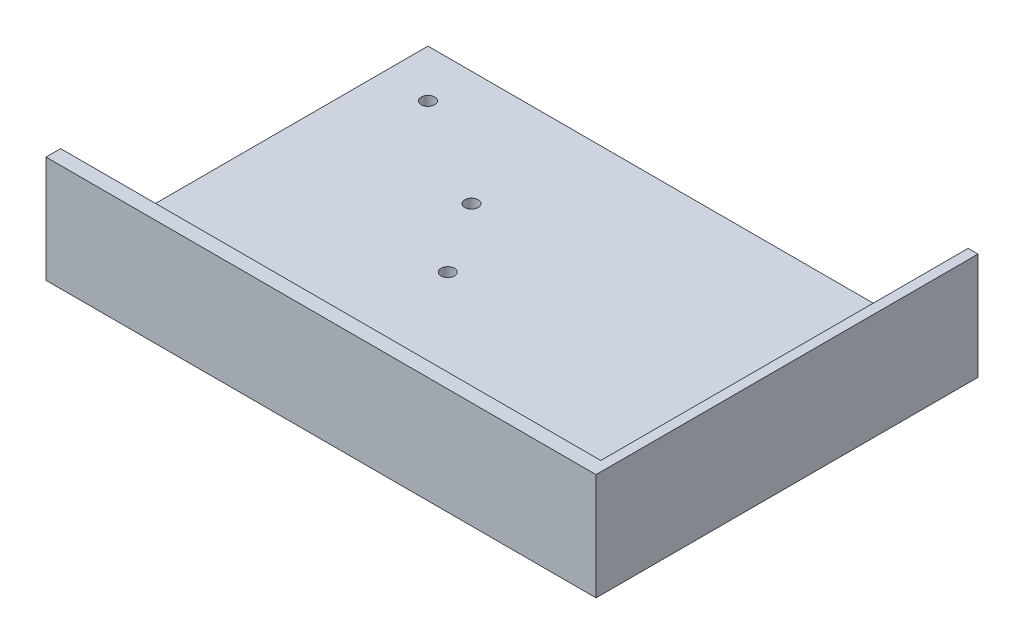
ISO-10303-21;
HEADER;
FILE_DESCRIPTION(('STEP AP214'),'2;1');
FILE_NAME('part.step','',(''),(''),'','','');
FILE_SCHEMA(('AUTOMOTIVE_DESIGN { 1 0 10303 214 1 1 1 1 }'));
ENDSEC;
DATA;
#1=APPLICATION_CONTEXT('core data for automotive mechanical design processes');
#2=APPLICATION_PROTOCOL_DEFINITION('international standard','automotive_design',2000,#1);
#3=PRODUCT_CONTEXT('',#1,'mechanical');
#4=PRODUCT('Part','Part','',(#3));
#5=PRODUCT_RELATED_PRODUCT_CATEGORY('part','',(#4));
#6=PRODUCT_DEFINITION_FORMATION('','',#4);
#7=PRODUCT_DEFINITION_CONTEXT('part definition',#1,'design');
#8=PRODUCT_DEFINITION('design','',#6,#7);
#9=PRODUCT_DEFINITION_SHAPE('','',#8);
#10=(LENGTH_UNIT() NAMED_UNIT(*) SI_UNIT(.MILLI.,.METRE.));
#11=(NAMED_UNIT(*) PLANE_ANGLE_UNIT() SI_UNIT($,.RADIAN.));
#12=(NAMED_UNIT(*) SI_UNIT($,.STERADIAN.) SOLID_ANGLE_UNIT());
#13=UNCERTAINTY_MEASURE_WITH_UNIT(LENGTH_MEASURE(1.E-05),#10,'distance_accuracy_value','');
#14=(GEOMETRIC_REPRESENTATION_CONTEXT(3) GLOBAL_UNCERTAINTY_ASSIGNED_CONTEXT((#13)) GLOBAL_UNIT_ASSIGNED_CONTEXT((#10,
#11,#12)) REPRESENTATION_CONTEXT('',''));
#15=CARTESIAN_POINT('',(0.,0.,0.));
#16=DIRECTION('',(0.,0.,1.));
#17=DIRECTION('',(1.,0.,0.));
#18=AXIS2_PLACEMENT_3D('',#15,#16,#17);
#19=CARTESIAN_POINT('',(139.1,27.,96.6));
#20=DIRECTION('',(-1.,0.,0.));
#21=DIRECTION('',(0.,0.,1.));
#22=AXIS2_PLACEMENT_3D('',#19,#20,#21);
#23=PLANE('',#22);
#24=DIRECTION('',(0.,0.,-1.));
#25=VECTOR('',#24,1.);
#26=CARTESIAN_POINT('',(139.1,0.,96.6));
#27=LINE('',#26,#25);
#28=CARTESIAN_POINT('',(139.1,0.,96.6));
#29=VERTEX_POINT('',#28);
#30=CARTESIAN_POINT('',(139.1,0.,0.));
#31=VERTEX_POINT('',#30);
#32=EDGE_CURVE('E141',#29,#31,#27,.T.);
#33=ORIENTED_EDGE('',*,*,#32,.T.);
#34=DIRECTION('',(0.,1.,0.));
#35=VECTOR('',#34,1.);
#36=CARTESIAN_POINT('',(139.1,27.,0.));
#37=LINE('',#36,#35);
#38=CARTESIAN_POINT('',(139.1,27.,0.));
#39=VERTEX_POINT('',#38);
#40=EDGE_CURVE('E162',#31,#39,#37,.T.);
#41=ORIENTED_EDGE('',*,*,#40,.T.);
#42=DIRECTION('',(0.,0.,-1.));
#43=VECTOR('',#42,1.);
#44=CARTESIAN_POINT('',(139.1,27.,96.6));
#45=LINE('',#44,#43);
#46=CARTESIAN_POINT('',(139.1,27.,96.6));
#47=VERTEX_POINT('',#46);
#48=EDGE_CURVE('E123',#47,#39,#45,.T.);
#49=ORIENTED_EDGE('',*,*,#48,.F.);
#50=DIRECTION('',(0.,-1.,0.));
#51=VECTOR('',#50,1.);
#52=CARTESIAN_POINT('',(139.1,27.,96.6));
#53=LINE('',#52,#51);
#54=EDGE_CURVE('E146',#47,#29,#53,.T.);
#55=ORIENTED_EDGE('',*,*,#54,.T.);
#56=EDGE_LOOP('',(#33,#41,#49,#55));
#57=FACE_BOUND('',#56,.T.);
#58=ADVANCED_FACE('F38',(#57),#23,.F.);
#59=CARTESIAN_POINT('',(-139.1,27.,96.6));
#60=DIRECTION('',(0.,0.,-1.));
#61=DIRECTION('',(-1.,0.,0.));
#62=AXIS2_PLACEMENT_3D('',#59,#60,#61);
#63=PLANE('',#62);
#64=DIRECTION('',(1.,0.,0.));
#65=VECTOR('',#64,1.);
#66=CARTESIAN_POINT('',(-139.1,27.,96.6));
#67=LINE('',#66,#65);
#68=CARTESIAN_POINT('',(0.,27.,96.6));
#69=VERTEX_POINT('',#68);
#70=EDGE_CURVE('E143',#69,#47,#67,.T.);
#71=ORIENTED_EDGE('',*,*,#70,.F.);
#72=DIRECTION('',(0.,-1.,0.));
#73=VECTOR('',#72,1.);
#74=CARTESIAN_POINT('',(0.,27.,96.6));
#75=LINE('',#74,#73);
#76=CARTESIAN_POINT('',(0.,0.,96.6));
#77=VERTEX_POINT('',#76);
#78=EDGE_CURVE('E178',#69,#77,#75,.T.);
#79=ORIENTED_EDGE('',*,*,#78,.T.);
#80=DIRECTION('',(1.,0.,0.));
#81=VECTOR('',#80,1.);
#82=CARTESIAN_POINT('',(-139.1,0.,96.6));
#83=LINE('',#82,#81);
#84=EDGE_CURVE('E144',#77,#29,#83,.T.);
#85=ORIENTED_EDGE('',*,*,#84,.T.);
#86=ORIENTED_EDGE('',*,*,#54,.F.);
#87=EDGE_LOOP('',(#71,#79,#85,#86));
#88=FACE_BOUND('',#87,.T.);
#89=ADVANCED_FACE('F237',(#88),#63,.F.);
#90=CARTESIAN_POINT('',(0.,27.,0.));
#91=DIRECTION('',(0.,-1.,0.));
#92=DIRECTION('',(0.,0.,-1.));
#93=AXIS2_PLACEMENT_3D('',#90,#91,#92);
#94=PLANE('',#93);
#95=ORIENTED_EDGE('',*,*,#48,.T.);
#96=DIRECTION('',(1.,0.,0.));
#97=VECTOR('',#96,1.);
#98=CARTESIAN_POINT('',(-200.,27.,0.));
#99=LINE('',#98,#97);
#100=CARTESIAN_POINT('',(136.6,27.,0.));
#101=VERTEX_POINT('',#100);
#102=EDGE_CURVE('E108',#101,#39,#99,.T.);
#103=ORIENTED_EDGE('',*,*,#102,.F.);
#104=DIRECTION('',(0.,0.,-1.));
#105=VECTOR('',#104,1.);
#106=CARTESIAN_POINT('',(136.6,27.,92.9));
#107=LINE('',#106,#105);
#108=CARTESIAN_POINT('',(136.6,27.,92.9));
#109=VERTEX_POINT('',#108);
#110=EDGE_CURVE('E121',#109,#101,#107,.T.);
#111=ORIENTED_EDGE('',*,*,#110,.F.);
#112=DIRECTION('',(1.,0.,0.));
#113=VECTOR('',#112,1.);
#114=CARTESIAN_POINT('',(-136.6,27.,92.9));
#115=LINE('',#114,#113);
#116=CARTESIAN_POINT('',(0.,27.,92.9));
#117=VERTEX_POINT('',#116);
#118=EDGE_CURVE('E130',#117,#109,#115,.T.);
#119=ORIENTED_EDGE('',*,*,#118,.F.);
#120=DIRECTION('',(0.,0.,-1.));
#121=VECTOR('',#120,1.);
#122=CARTESIAN_POINT('',(0.,27.,200.));
#123=LINE('',#122,#121);
#124=EDGE_CURVE('E164',#69,#117,#123,.T.);
#125=ORIENTED_EDGE('',*,*,#124,.F.);
#126=ORIENTED_EDGE('',*,*,#70,.T.);
#127=EDGE_LOOP('',(#95,#103,#111,#119,#125,#126));
#128=FACE_BOUND('',#127,.T.);
#129=ADVANCED_FACE('F119',(#128),#94,.F.);
#130=CARTESIAN_POINT('',(0.,0.,0.));
#131=DIRECTION('',(0.,-1.,0.));
#132=DIRECTION('',(0.,0.,-1.));
#133=AXIS2_PLACEMENT_3D('',#130,#131,#132);
#134=PLANE('',#133);
#135=DIRECTION('',(-1.,0.,0.));
#136=VECTOR('',#135,1.);
#137=CARTESIAN_POINT('',(0.,0.,0.));
#138=LINE('',#137,#136);
#139=CARTESIAN_POINT('',(0.,0.,0.));
#140=VERTEX_POINT('',#139);
#141=EDGE_CURVE('E52',#31,#140,#138,.T.);
#142=ORIENTED_EDGE('',*,*,#141,.F.);
#143=ORIENTED_EDGE('',*,*,#32,.F.);
#144=ORIENTED_EDGE('',*,*,#84,.F.);
#145=DIRECTION('',(0.,0.,1.));
#146=VECTOR('',#145,1.);
#147=CARTESIAN_POINT('',(0.,0.,0.));
#148=LINE('',#147,#146);
#149=EDGE_CURVE('E161',#140,#77,#148,.T.);
#150=ORIENTED_EDGE('',*,*,#149,.F.);
#151=EDGE_LOOP('',(#142,#143,#144,#150));
#152=FACE_BOUND('',#151,.T.);
#153=CARTESIAN_POINT('',(124.,0.,12.));
#154=DIRECTION('',(0.,-1.,0.));
#155=DIRECTION('',(0.,0.,-1.));
#156=AXIS2_PLACEMENT_3D('',#153,#154,#155);
#157=CIRCLE('',#156,1.70000000000001);
#158=CARTESIAN_POINT('',(124.,0.,10.3));
#159=VERTEX_POINT('',#158);
#160=EDGE_CURVE('E214',#159,#159,#157,.T.);
#161=ORIENTED_EDGE('',*,*,#160,.F.);
#162=EDGE_LOOP('',(#161));
#163=FACE_BOUND('',#162,.T.);
#164=CARTESIAN_POINT('',(12.,0.,12.));
#165=DIRECTION('',(0.,-1.,0.));
#166=DIRECTION('',(0.,0.,-1.));
#167=AXIS2_PLACEMENT_3D('',#164,#165,#166);
#168=CIRCLE('',#167,1.7);
#169=CARTESIAN_POINT('',(12.,0.,10.3));
#170=VERTEX_POINT('',#169);
#171=EDGE_CURVE('E211',#170,#170,#168,.T.);
#172=ORIENTED_EDGE('',*,*,#171,.F.);
#173=EDGE_LOOP('',(#172));
#174=FACE_BOUND('',#173,.T.);
#175=CARTESIAN_POINT('',(40.,0.,89.));
#176=DIRECTION('',(0.,-1.,0.));
#177=DIRECTION('',(0.,0.,-1.));
#178=AXIS2_PLACEMENT_3D('',#175,#176,#177);
#179=CIRCLE('',#178,1.7);
#180=CARTESIAN_POINT('',(40.,0.,87.3));
#181=VERTEX_POINT('',#180);
#182=EDGE_CURVE('E208',#181,#181,#179,.T.);
#183=ORIENTED_EDGE('',*,*,#182,.F.);
#184=EDGE_LOOP('',(#183));
#185=FACE_BOUND('',#184,.T.);
#186=CARTESIAN_POINT('',(40.,0.,29.));
#187=DIRECTION('',(0.,-1.,0.));
#188=DIRECTION('',(0.,0.,-1.));
#189=AXIS2_PLACEMENT_3D('',#186,#187,#188);
#190=CIRCLE('',#189,1.7);
#191=CARTESIAN_POINT('',(40.,0.,27.3));
#192=VERTEX_POINT('',#191);
#193=EDGE_CURVE('E205',#192,#192,#190,.T.);
#194=ORIENTED_EDGE('',*,*,#193,.F.);
#195=EDGE_LOOP('',(#194));
#196=FACE_BOUND('',#195,.T.);
#197=CARTESIAN_POINT('',(52.,0.,71.));
#198=DIRECTION('',(0.,-1.,0.));
#199=DIRECTION('',(0.,0.,-1.));
#200=AXIS2_PLACEMENT_3D('',#197,#198,#199);
#201=CIRCLE('',#200,1.7);
#202=CARTESIAN_POINT('',(52.,0.,69.3));
#203=VERTEX_POINT('',#202);
#204=EDGE_CURVE('E202',#203,#203,#201,.T.);
#205=ORIENTED_EDGE('',*,*,#204,.F.);
#206=EDGE_LOOP('',(#205));
#207=FACE_BOUND('',#206,.T.);
#208=CARTESIAN_POINT('',(52.,0.,47.));
#209=DIRECTION('',(0.,-1.,0.));
#210=DIRECTION('',(0.,0.,-1.));
#211=AXIS2_PLACEMENT_3D('',#208,#209,#210);
#212=CIRCLE('',#211,1.7);
#213=CARTESIAN_POINT('',(52.,0.,45.3));
#214=VERTEX_POINT('',#213);
#215=EDGE_CURVE('E199',#214,#214,#212,.T.);
#216=ORIENTED_EDGE('',*,*,#215,.F.);
#217=EDGE_LOOP('',(#216));
#218=FACE_BOUND('',#217,.T.);
#219=ADVANCED_FACE('F158',(#152,#163,#174,#185,#196,#207,#218),#134,.T.);
#220=CARTESIAN_POINT('',(136.6,25.5,92.9));
#221=DIRECTION('',(1.,0.,0.));
#222=DIRECTION('',(0.,0.,-1.));
#223=AXIS2_PLACEMENT_3D('',#220,#221,#222);
#224=PLANE('',#223);
#225=ORIENTED_EDGE('',*,*,#110,.T.);
#226=DIRECTION('',(0.,-1.,0.));
#227=VECTOR('',#226,1.);
#228=CARTESIAN_POINT('',(136.6,25.5,0.));
#229=LINE('',#228,#227);
#230=CARTESIAN_POINT('',(136.6,3.,0.));
#231=VERTEX_POINT('',#230);
#232=EDGE_CURVE('E105',#101,#231,#229,.T.);
#233=ORIENTED_EDGE('',*,*,#232,.T.);
#234=DIRECTION('',(0.,0.,-1.));
#235=VECTOR('',#234,1.);
#236=CARTESIAN_POINT('',(136.6,3.,94.1));
#237=LINE('',#236,#235);
#238=CARTESIAN_POINT('',(136.6,3.,94.1));
#239=VERTEX_POINT('',#238);
#240=EDGE_CURVE('E218',#239,#231,#237,.T.);
#241=ORIENTED_EDGE('',*,*,#240,.F.);
#242=DIRECTION('',(0.,1.,0.));
#243=VECTOR('',#242,1.);
#244=CARTESIAN_POINT('',(136.6,3.,94.1));
#245=LINE('',#244,#243);
#246=CARTESIAN_POINT('',(136.6,25.5,94.1));
#247=VERTEX_POINT('',#246);
#248=EDGE_CURVE('E131',#239,#247,#245,.T.);
#249=ORIENTED_EDGE('',*,*,#248,.T.);
#250=DIRECTION('',(0.,0.,-1.));
#251=VECTOR('',#250,1.);
#252=CARTESIAN_POINT('',(136.6,25.5,94.1));
#253=LINE('',#252,#251);
#254=CARTESIAN_POINT('',(136.6,25.5,92.9));
#255=VERTEX_POINT('',#254);
#256=EDGE_CURVE('E217',#247,#255,#253,.T.);
#257=ORIENTED_EDGE('',*,*,#256,.T.);
#258=DIRECTION('',(0.,1.,0.));
#259=VECTOR('',#258,1.);
#260=CARTESIAN_POINT('',(136.6,25.5,92.9));
#261=LINE('',#260,#259);
#262=EDGE_CURVE('E129',#255,#109,#261,.T.);
#263=ORIENTED_EDGE('',*,*,#262,.T.);
#264=EDGE_LOOP('',(#225,#233,#241,#249,#257,#263));
#265=FACE_BOUND('',#264,.T.);
#266=ADVANCED_FACE('F126',(#265),#224,.F.);
#267=CARTESIAN_POINT('',(-136.6,25.5,92.9));
#268=DIRECTION('',(0.,0.,1.));
#269=DIRECTION('',(1.,0.,0.));
#270=AXIS2_PLACEMENT_3D('',#267,#268,#269);
#271=PLANE('',#270);
#272=DIRECTION('',(1.,0.,0.));
#273=VECTOR('',#272,1.);
#274=CARTESIAN_POINT('',(-136.6,25.5,92.9));
#275=LINE('',#274,#273);
#276=CARTESIAN_POINT('',(0.,25.5,92.9));
#277=VERTEX_POINT('',#276);
#278=EDGE_CURVE('E133',#277,#255,#275,.T.);
#279=ORIENTED_EDGE('',*,*,#278,.F.);
#280=DIRECTION('',(0.,1.,0.));
#281=VECTOR('',#280,1.);
#282=CARTESIAN_POINT('',(0.,25.5,92.9));
#283=LINE('',#282,#281);
#284=EDGE_CURVE('E174',#277,#117,#283,.T.);
#285=ORIENTED_EDGE('',*,*,#284,.T.);
#286=ORIENTED_EDGE('',*,*,#118,.T.);
#287=ORIENTED_EDGE('',*,*,#262,.F.);
#288=EDGE_LOOP('',(#279,#285,#286,#287));
#289=FACE_BOUND('',#288,.T.);
#290=ADVANCED_FACE('F234',(#289),#271,.F.);
#291=CARTESIAN_POINT('',(0.,25.5,0.));
#292=DIRECTION('',(0.,-1.,0.));
#293=DIRECTION('',(0.,0.,-1.));
#294=AXIS2_PLACEMENT_3D('',#291,#292,#293);
#295=PLANE('',#294);
#296=DIRECTION('',(0.,0.,1.));
#297=VECTOR('',#296,1.);
#298=CARTESIAN_POINT('',(0.,25.5,0.));
#299=LINE('',#298,#297);
#300=CARTESIAN_POINT('',(0.,25.5,94.1));
#301=VERTEX_POINT('',#300);
#302=EDGE_CURVE('E172',#277,#301,#299,.T.);
#303=ORIENTED_EDGE('',*,*,#302,.F.);
#304=ORIENTED_EDGE('',*,*,#278,.T.);
#305=ORIENTED_EDGE('',*,*,#256,.F.);
#306=DIRECTION('',(1.,0.,0.));
#307=VECTOR('',#306,1.);
#308=CARTESIAN_POINT('',(-136.6,25.5,94.1));
#309=LINE('',#308,#307);
#310=EDGE_CURVE('E220',#301,#247,#309,.T.);
#311=ORIENTED_EDGE('',*,*,#310,.F.);
#312=EDGE_LOOP('',(#303,#304,#305,#311));
#313=FACE_BOUND('',#312,.T.);
#314=ADVANCED_FACE('F231',(#313),#295,.T.);
#315=CARTESIAN_POINT('',(-136.6,3.,94.1));
#316=DIRECTION('',(0.,0.,1.));
#317=DIRECTION('',(1.,0.,0.));
#318=AXIS2_PLACEMENT_3D('',#315,#316,#317);
#319=PLANE('',#318);
#320=DIRECTION('',(1.,0.,0.));
#321=VECTOR('',#320,1.);
#322=CARTESIAN_POINT('',(-136.6,3.,94.1));
#323=LINE('',#322,#321);
#324=CARTESIAN_POINT('',(0.,3.,94.1));
#325=VERTEX_POINT('',#324);
#326=EDGE_CURVE('E136',#325,#239,#323,.T.);
#327=ORIENTED_EDGE('',*,*,#326,.F.);
#328=DIRECTION('',(0.,1.,0.));
#329=VECTOR('',#328,1.);
#330=CARTESIAN_POINT('',(0.,3.,94.1));
#331=LINE('',#330,#329);
#332=EDGE_CURVE('E169',#325,#301,#331,.T.);
#333=ORIENTED_EDGE('',*,*,#332,.T.);
#334=ORIENTED_EDGE('',*,*,#310,.T.);
#335=ORIENTED_EDGE('',*,*,#248,.F.);
#336=EDGE_LOOP('',(#327,#333,#334,#335));
#337=FACE_BOUND('',#336,.T.);
#338=ADVANCED_FACE('F227',(#337),#319,.F.);
#339=CARTESIAN_POINT('',(0.,3.,0.));
#340=DIRECTION('',(0.,-1.,0.));
#341=DIRECTION('',(0.,0.,-1.));
#342=AXIS2_PLACEMENT_3D('',#339,#340,#341);
#343=PLANE('',#342);
#344=CARTESIAN_POINT('',(124.,3.,12.));
#345=DIRECTION('',(0.,1.,0.));
#346=DIRECTION('',(0.,0.,1.));
#347=AXIS2_PLACEMENT_3D('',#344,#345,#346);
#348=CIRCLE('',#347,1.70000000000001);
#349=CARTESIAN_POINT('',(124.,3.,13.7));
#350=VERTEX_POINT('',#349);
#351=EDGE_CURVE('E184',#350,#350,#348,.T.);
#352=ORIENTED_EDGE('',*,*,#351,.F.);
#353=EDGE_LOOP('',(#352));
#354=FACE_BOUND('',#353,.T.);
#355=CARTESIAN_POINT('',(12.,3.,12.));
#356=DIRECTION('',(0.,1.,0.));
#357=DIRECTION('',(0.,0.,1.));
#358=AXIS2_PLACEMENT_3D('',#355,#356,#357);
#359=CIRCLE('',#358,1.7);
#360=CARTESIAN_POINT('',(12.,3.,13.7));
#361=VERTEX_POINT('',#360);
#362=EDGE_CURVE('E181',#361,#361,#359,.T.);
#363=ORIENTED_EDGE('',*,*,#362,.F.);
#364=EDGE_LOOP('',(#363));
#365=FACE_BOUND('',#364,.T.);
#366=CARTESIAN_POINT('',(40.,3.,89.));
#367=DIRECTION('',(0.,1.,0.));
#368=DIRECTION('',(0.,0.,1.));
#369=AXIS2_PLACEMENT_3D('',#366,#367,#368);
#370=CIRCLE('',#369,1.7);
#371=CARTESIAN_POINT('',(40.,3.,90.7));
#372=VERTEX_POINT('',#371);
#373=EDGE_CURVE('E193',#372,#372,#370,.T.);
#374=ORIENTED_EDGE('',*,*,#373,.F.);
#375=EDGE_LOOP('',(#374));
#376=FACE_BOUND('',#375,.T.);
#377=CARTESIAN_POINT('',(40.,3.,29.));
#378=DIRECTION('',(0.,1.,0.));
#379=DIRECTION('',(0.,0.,1.));
#380=AXIS2_PLACEMENT_3D('',#377,#378,#379);
#381=CIRCLE('',#380,1.7);
#382=CARTESIAN_POINT('',(40.,3.,30.7));
#383=VERTEX_POINT('',#382);
#384=EDGE_CURVE('E196',#383,#383,#381,.T.);
#385=ORIENTED_EDGE('',*,*,#384,.F.);
#386=EDGE_LOOP('',(#385));
#387=FACE_BOUND('',#386,.T.);
#388=CARTESIAN_POINT('',(52.,3.,71.));
#389=DIRECTION('',(0.,1.,0.));
#390=DIRECTION('',(0.,0.,1.));
#391=AXIS2_PLACEMENT_3D('',#388,#389,#390);
#392=CIRCLE('',#391,1.7);
#393=CARTESIAN_POINT('',(52.,3.,72.7));
#394=VERTEX_POINT('',#393);
#395=EDGE_CURVE('E187',#394,#394,#392,.T.);
#396=ORIENTED_EDGE('',*,*,#395,.F.);
#397=EDGE_LOOP('',(#396));
#398=FACE_BOUND('',#397,.T.);
#399=CARTESIAN_POINT('',(52.,3.,47.));
#400=DIRECTION('',(0.,1.,0.));
#401=DIRECTION('',(0.,0.,1.));
#402=AXIS2_PLACEMENT_3D('',#399,#400,#401);
#403=CIRCLE('',#402,1.7);
#404=CARTESIAN_POINT('',(52.,3.,48.7));
#405=VERTEX_POINT('',#404);
#406=EDGE_CURVE('E190',#405,#405,#403,.T.);
#407=ORIENTED_EDGE('',*,*,#406,.F.);
#408=EDGE_LOOP('',(#407));
#409=FACE_BOUND('',#408,.T.);
#410=ORIENTED_EDGE('',*,*,#240,.T.);
#411=DIRECTION('',(-1.,0.,0.));
#412=VECTOR('',#411,1.);
#413=CARTESIAN_POINT('',(0.,3.,0.));
#414=LINE('',#413,#412);
#415=CARTESIAN_POINT('',(0.,3.,0.));
#416=VERTEX_POINT('',#415);
#417=EDGE_CURVE('E110',#231,#416,#414,.T.);
#418=ORIENTED_EDGE('',*,*,#417,.T.);
#419=DIRECTION('',(0.,0.,1.));
#420=VECTOR('',#419,1.);
#421=CARTESIAN_POINT('',(0.,3.,0.));
#422=LINE('',#421,#420);
#423=EDGE_CURVE('E45',#416,#325,#422,.T.);
#424=ORIENTED_EDGE('',*,*,#423,.T.);
#425=ORIENTED_EDGE('',*,*,#326,.T.);
#426=EDGE_LOOP('',(#410,#418,#424,#425));
#427=FACE_BOUND('',#426,.T.);
#428=ADVANCED_FACE('F239',(#354,#365,#376,#387,#398,#409,#427),#343,.F.);
#429=CARTESIAN_POINT('',(52.,-1.,47.));
#430=DIRECTION('',(0.,1.,0.));
#431=DIRECTION('',(0.,0.,1.));
#432=AXIS2_PLACEMENT_3D('',#429,#430,#431);
#433=CYLINDRICAL_SURFACE('',#432,1.7);
#434=ORIENTED_EDGE('',*,*,#215,.T.);
#435=EDGE_LOOP('',(#434));
#436=FACE_BOUND('',#435,.T.);
#437=ORIENTED_EDGE('',*,*,#406,.T.);
#438=EDGE_LOOP('',(#437));
#439=FACE_BOUND('',#438,.T.);
#440=ADVANCED_FACE('F241',(#436,#439),#433,.F.);
#441=CARTESIAN_POINT('',(52.,-1.,71.));
#442=DIRECTION('',(0.,1.,0.));
#443=DIRECTION('',(0.,0.,1.));
#444=AXIS2_PLACEMENT_3D('',#441,#442,#443);
#445=CYLINDRICAL_SURFACE('',#444,1.7);
#446=ORIENTED_EDGE('',*,*,#204,.T.);
#447=EDGE_LOOP('',(#446));
#448=FACE_BOUND('',#447,.T.);
#449=ORIENTED_EDGE('',*,*,#395,.T.);
#450=EDGE_LOOP('',(#449));
#451=FACE_BOUND('',#450,.T.);
#452=ADVANCED_FACE('F249',(#448,#451),#445,.F.);
#453=CARTESIAN_POINT('',(40.,-1.,29.));
#454=DIRECTION('',(0.,1.,0.));
#455=DIRECTION('',(0.,0.,1.));
#456=AXIS2_PLACEMENT_3D('',#453,#454,#455);
#457=CYLINDRICAL_SURFACE('',#456,1.7);
#458=ORIENTED_EDGE('',*,*,#193,.T.);
#459=EDGE_LOOP('',(#458));
#460=FACE_BOUND('',#459,.T.);
#461=ORIENTED_EDGE('',*,*,#384,.T.);
#462=EDGE_LOOP('',(#461));
#463=FACE_BOUND('',#462,.T.);
#464=ADVANCED_FACE('F303',(#460,#463),#457,.F.);
#465=CARTESIAN_POINT('',(40.,-1.,89.));
#466=DIRECTION('',(0.,1.,0.));
#467=DIRECTION('',(0.,0.,1.));
#468=AXIS2_PLACEMENT_3D('',#465,#466,#467);
#469=CYLINDRICAL_SURFACE('',#468,1.7);
#470=ORIENTED_EDGE('',*,*,#182,.T.);
#471=EDGE_LOOP('',(#470));
#472=FACE_BOUND('',#471,.T.);
#473=ORIENTED_EDGE('',*,*,#373,.T.);
#474=EDGE_LOOP('',(#473));
#475=FACE_BOUND('',#474,.T.);
#476=ADVANCED_FACE('F313',(#472,#475),#469,.F.);
#477=CARTESIAN_POINT('',(12.,-1.,12.));
#478=DIRECTION('',(0.,1.,0.));
#479=DIRECTION('',(0.,0.,1.));
#480=AXIS2_PLACEMENT_3D('',#477,#478,#479);
#481=CYLINDRICAL_SURFACE('',#480,1.7);
#482=ORIENTED_EDGE('',*,*,#171,.T.);
#483=EDGE_LOOP('',(#482));
#484=FACE_BOUND('',#483,.T.);
#485=ORIENTED_EDGE('',*,*,#362,.T.);
#486=EDGE_LOOP('',(#485));
#487=FACE_BOUND('',#486,.T.);
#488=ADVANCED_FACE('F322',(#484,#487),#481,.F.);
#489=CARTESIAN_POINT('',(124.,-1.,12.));
#490=DIRECTION('',(0.,1.,0.));
#491=DIRECTION('',(0.,0.,1.));
#492=AXIS2_PLACEMENT_3D('',#489,#490,#491);
#493=CYLINDRICAL_SURFACE('',#492,1.70000000000001);
#494=ORIENTED_EDGE('',*,*,#160,.T.);
#495=EDGE_LOOP('',(#494));
#496=FACE_BOUND('',#495,.T.);
#497=ORIENTED_EDGE('',*,*,#351,.T.);
#498=EDGE_LOOP('',(#497));
#499=FACE_BOUND('',#498,.T.);
#500=ADVANCED_FACE('F332',(#496,#499),#493,.F.);
#501=CARTESIAN_POINT('',(0.,-1.2E-05,200.));
#502=DIRECTION('',(1.,0.,0.));
#503=DIRECTION('',(0.,0.,-1.));
#504=AXIS2_PLACEMENT_3D('',#501,#502,#503);
#505=PLANE('',#504);
#506=ORIENTED_EDGE('',*,*,#423,.F.);
#507=DIRECTION('',(0.,-1.,0.));
#508=VECTOR('',#507,1.);
#509=CARTESIAN_POINT('',(0.,-1.2E-05,0.));
#510=LINE('',#509,#508);
#511=EDGE_CURVE('E11',#416,#140,#510,.T.);
#512=ORIENTED_EDGE('',*,*,#511,.T.);
#513=ORIENTED_EDGE('',*,*,#149,.T.);
#514=ORIENTED_EDGE('',*,*,#78,.F.);
#515=ORIENTED_EDGE('',*,*,#124,.T.);
#516=ORIENTED_EDGE('',*,*,#284,.F.);
#517=ORIENTED_EDGE('',*,*,#302,.T.);
#518=ORIENTED_EDGE('',*,*,#332,.F.);
#519=EDGE_LOOP('',(#506,#512,#513,#514,#515,#516,#517,#518));
#520=FACE_BOUND('',#519,.T.);
#521=ADVANCED_FACE('F238',(#520),#505,.F.);
#522=CARTESIAN_POINT('',(-200.,-1.2E-05,0.));
#523=DIRECTION('',(0.,0.,1.));
#524=DIRECTION('',(1.,0.,0.));
#525=AXIS2_PLACEMENT_3D('',#522,#523,#524);
#526=PLANE('',#525);
#527=ORIENTED_EDGE('',*,*,#141,.T.);
#528=ORIENTED_EDGE('',*,*,#511,.F.);
#529=ORIENTED_EDGE('',*,*,#417,.F.);
#530=ORIENTED_EDGE('',*,*,#232,.F.);
#531=ORIENTED_EDGE('',*,*,#102,.T.);
#532=ORIENTED_EDGE('',*,*,#40,.F.);
#533=EDGE_LOOP('',(#527,#528,#529,#530,#531,#532));
#534=FACE_BOUND('',#533,.T.);
#535=ADVANCED_FACE('F107',(#534),#526,.F.);
#536=CLOSED_SHELL('',(#58,#89,#129,#219,#266,#290,#314,#338,#428,#440,#452,#464,#476,#488,#500,
#521,#535));
#537=MANIFOLD_SOLID_BREP('B2',#536);
#538=ADVANCED_BREP_SHAPE_REPRESENTATION('',(#18,#537),#14);
#539=SHAPE_DEFINITION_REPRESENTATION(#9,#538);
ENDSEC;
END-ISO-10303-21;
